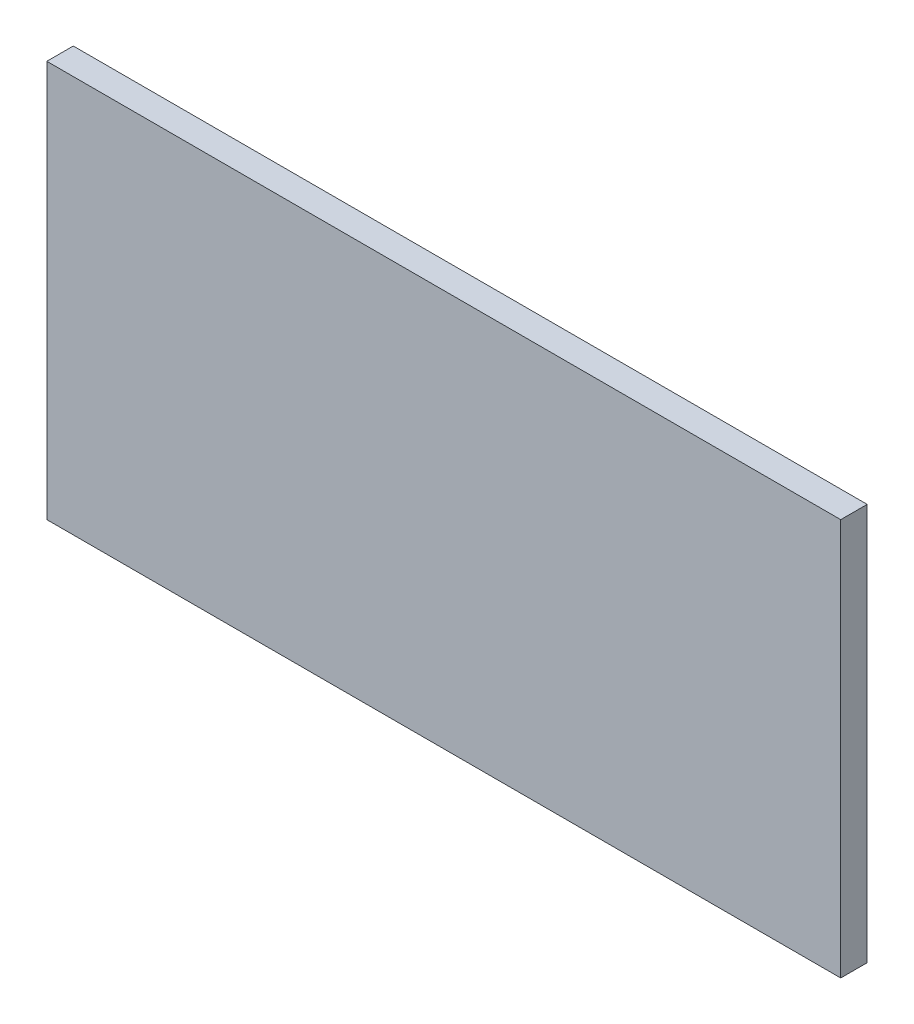
ISO-10303-21;
HEADER;
FILE_DESCRIPTION(('STEP AP214'),'2;1');
FILE_NAME('part.step','',(''),(''),'','','');
FILE_SCHEMA(('AUTOMOTIVE_DESIGN { 1 0 10303 214 1 1 1 1 }'));
ENDSEC;
DATA;
#1=APPLICATION_CONTEXT('core data for automotive mechanical design processes');
#2=APPLICATION_PROTOCOL_DEFINITION('international standard','automotive_design',2000,#1);
#3=PRODUCT_CONTEXT('',#1,'mechanical');
#4=PRODUCT('Part','Part','',(#3));
#5=PRODUCT_RELATED_PRODUCT_CATEGORY('part','',(#4));
#6=PRODUCT_DEFINITION_FORMATION('','',#4);
#7=PRODUCT_DEFINITION_CONTEXT('part definition',#1,'design');
#8=PRODUCT_DEFINITION('design','',#6,#7);
#9=PRODUCT_DEFINITION_SHAPE('','',#8);
#10=(LENGTH_UNIT() NAMED_UNIT(*) SI_UNIT(.MILLI.,.METRE.));
#11=(NAMED_UNIT(*) PLANE_ANGLE_UNIT() SI_UNIT($,.RADIAN.));
#12=(NAMED_UNIT(*) SI_UNIT($,.STERADIAN.) SOLID_ANGLE_UNIT());
#13=UNCERTAINTY_MEASURE_WITH_UNIT(LENGTH_MEASURE(1.E-05),#10,'distance_accuracy_value','');
#14=(GEOMETRIC_REPRESENTATION_CONTEXT(3) GLOBAL_UNCERTAINTY_ASSIGNED_CONTEXT((#13)) GLOBAL_UNIT_ASSIGNED_CONTEXT((#10,
#11,#12)) REPRESENTATION_CONTEXT('',''));
#15=CARTESIAN_POINT('',(0.,0.,0.));
#16=DIRECTION('',(0.,0.,1.));
#17=DIRECTION('',(1.,0.,0.));
#18=AXIS2_PLACEMENT_3D('',#15,#16,#17);
#19=CARTESIAN_POINT('',(0.,0.,-2.));
#20=DIRECTION('',(0.,0.,-1.));
#21=DIRECTION('',(-1.,0.,0.));
#22=AXIS2_PLACEMENT_3D('',#19,#20,#21);
#23=PLANE('',#22);
#24=DIRECTION('',(0.,1.,0.));
#25=VECTOR('',#24,1.);
#26=CARTESIAN_POINT('',(-2.,3.75,-2.));
#27=LINE('',#26,#25);
#28=CARTESIAN_POINT('',(-2.,-3.75,-2.));
#29=VERTEX_POINT('',#28);
#30=CARTESIAN_POINT('',(-2.,3.75,-2.));
#31=VERTEX_POINT('',#30);
#32=EDGE_CURVE('E167',#29,#31,#27,.T.);
#33=ORIENTED_EDGE('',*,*,#32,.F.);
#34=DIRECTION('',(-1.,0.,0.));
#35=VECTOR('',#34,1.);
#36=CARTESIAN_POINT('',(3.75,-3.75,-2.));
#37=LINE('',#36,#35);
#38=CARTESIAN_POINT('',(-3.75,-3.75,-2.));
#39=VERTEX_POINT('',#38);
#40=EDGE_CURVE('E162',#29,#39,#37,.T.);
#41=ORIENTED_EDGE('',*,*,#40,.T.);
#42=DIRECTION('',(0.,1.,0.));
#43=VECTOR('',#42,1.);
#44=CARTESIAN_POINT('',(-3.75,3.75,-2.));
#45=LINE('',#44,#43);
#46=CARTESIAN_POINT('',(-3.75,3.75,-2.));
#47=VERTEX_POINT('',#46);
#48=EDGE_CURVE('E187',#39,#47,#45,.T.);
#49=ORIENTED_EDGE('',*,*,#48,.T.);
#50=DIRECTION('',(1.,0.,0.));
#51=VECTOR('',#50,1.);
#52=CARTESIAN_POINT('',(3.75,3.75,-2.));
#53=LINE('',#52,#51);
#54=EDGE_CURVE('E193',#47,#31,#53,.T.);
#55=ORIENTED_EDGE('',*,*,#54,.T.);
#56=EDGE_LOOP('',(#33,#41,#49,#55));
#57=FACE_BOUND('',#56,.T.);
#58=ADVANCED_FACE('F41',(#57),#23,.T.);
#59=CARTESIAN_POINT('',(0.,0.,0.));
#60=DIRECTION('',(0.,0.,1.));
#61=DIRECTION('',(1.,0.,0.));
#62=AXIS2_PLACEMENT_3D('',#59,#60,#61);
#63=PLANE('',#62);
#64=DIRECTION('',(0.,1.,0.));
#65=VECTOR('',#64,1.);
#66=CARTESIAN_POINT('',(75.,37.5,0.));
#67=LINE('',#66,#65);
#68=CARTESIAN_POINT('',(75.,-37.5,0.));
#69=VERTEX_POINT('',#68);
#70=CARTESIAN_POINT('',(75.,37.5,0.));
#71=VERTEX_POINT('',#70);
#72=EDGE_CURVE('E227',#69,#71,#67,.T.);
#73=ORIENTED_EDGE('',*,*,#72,.F.);
#74=DIRECTION('',(1.,0.,0.));
#75=VECTOR('',#74,1.);
#76=CARTESIAN_POINT('',(-75.,-37.5,0.));
#77=LINE('',#76,#75);
#78=CARTESIAN_POINT('',(-75.,-37.5,0.));
#79=VERTEX_POINT('',#78);
#80=EDGE_CURVE('E233',#79,#69,#77,.T.);
#81=ORIENTED_EDGE('',*,*,#80,.F.);
#82=DIRECTION('',(0.,-1.,0.));
#83=VECTOR('',#82,1.);
#84=CARTESIAN_POINT('',(-75.,37.5,0.));
#85=LINE('',#84,#83);
#86=CARTESIAN_POINT('',(-75.,37.5,0.));
#87=VERTEX_POINT('',#86);
#88=EDGE_CURVE('E249',#87,#79,#85,.T.);
#89=ORIENTED_EDGE('',*,*,#88,.F.);
#90=DIRECTION('',(-1.,0.,0.));
#91=VECTOR('',#90,1.);
#92=CARTESIAN_POINT('',(-75.,37.5,0.));
#93=LINE('',#92,#91);
#94=EDGE_CURVE('E246',#71,#87,#93,.T.);
#95=ORIENTED_EDGE('',*,*,#94,.F.);
#96=EDGE_LOOP('',(#73,#81,#89,#95));
#97=FACE_BOUND('',#96,.T.);
#98=DIRECTION('',(0.,1.,0.));
#99=VECTOR('',#98,1.);
#100=CARTESIAN_POINT('',(-3.75,3.75,0.));
#101=LINE('',#100,#99);
#102=CARTESIAN_POINT('',(-3.75,-3.75,0.));
#103=VERTEX_POINT('',#102);
#104=CARTESIAN_POINT('',(-3.75,3.75,0.));
#105=VERTEX_POINT('',#104);
#106=EDGE_CURVE('E186',#103,#105,#101,.T.);
#107=ORIENTED_EDGE('',*,*,#106,.F.);
#108=DIRECTION('',(-1.,0.,0.));
#109=VECTOR('',#108,1.);
#110=CARTESIAN_POINT('',(3.75,-3.75,0.));
#111=LINE('',#110,#109);
#112=CARTESIAN_POINT('',(3.75,-3.75,0.));
#113=VERTEX_POINT('',#112);
#114=EDGE_CURVE('E192',#113,#103,#111,.T.);
#115=ORIENTED_EDGE('',*,*,#114,.F.);
#116=DIRECTION('',(0.,-1.,0.));
#117=VECTOR('',#116,1.);
#118=CARTESIAN_POINT('',(3.75,3.75,0.));
#119=LINE('',#118,#117);
#120=CARTESIAN_POINT('',(3.75,3.75,0.));
#121=VERTEX_POINT('',#120);
#122=EDGE_CURVE('E206',#121,#113,#119,.T.);
#123=ORIENTED_EDGE('',*,*,#122,.F.);
#124=DIRECTION('',(1.,0.,0.));
#125=VECTOR('',#124,1.);
#126=CARTESIAN_POINT('',(3.75,3.75,0.));
#127=LINE('',#126,#125);
#128=EDGE_CURVE('E202',#105,#121,#127,.T.);
#129=ORIENTED_EDGE('',*,*,#128,.F.);
#130=EDGE_LOOP('',(#107,#115,#123,#129));
#131=FACE_BOUND('',#130,.T.);
#132=ADVANCED_FACE('F327',(#97,#131),#63,.F.);
#133=CARTESIAN_POINT('',(75.,37.5,5.));
#134=DIRECTION('',(-1.,0.,0.));
#135=DIRECTION('',(0.,0.,1.));
#136=AXIS2_PLACEMENT_3D('',#133,#134,#135);
#137=PLANE('',#136);
#138=ORIENTED_EDGE('',*,*,#72,.T.);
#139=DIRECTION('',(0.,0.,-1.));
#140=VECTOR('',#139,1.);
#141=CARTESIAN_POINT('',(75.,37.5,5.));
#142=LINE('',#141,#140);
#143=CARTESIAN_POINT('',(75.,37.5,5.));
#144=VERTEX_POINT('',#143);
#145=EDGE_CURVE('E265',#144,#71,#142,.T.);
#146=ORIENTED_EDGE('',*,*,#145,.F.);
#147=DIRECTION('',(0.,1.,0.));
#148=VECTOR('',#147,1.);
#149=CARTESIAN_POINT('',(75.,37.5,5.));
#150=LINE('',#149,#148);
#151=CARTESIAN_POINT('',(75.,-37.5,5.));
#152=VERTEX_POINT('',#151);
#153=EDGE_CURVE('E228',#152,#144,#150,.T.);
#154=ORIENTED_EDGE('',*,*,#153,.F.);
#155=DIRECTION('',(0.,0.,-1.));
#156=VECTOR('',#155,1.);
#157=CARTESIAN_POINT('',(75.,-37.5,5.));
#158=LINE('',#157,#156);
#159=EDGE_CURVE('E242',#152,#69,#158,.T.);
#160=ORIENTED_EDGE('',*,*,#159,.T.);
#161=EDGE_LOOP('',(#138,#146,#154,#160));
#162=FACE_BOUND('',#161,.T.);
#163=ADVANCED_FACE('F334',(#162),#137,.F.);
#164=CARTESIAN_POINT('',(-75.,37.5,5.));
#165=DIRECTION('',(0.,-1.,0.));
#166=DIRECTION('',(0.,0.,-1.));
#167=AXIS2_PLACEMENT_3D('',#164,#165,#166);
#168=PLANE('',#167);
#169=ORIENTED_EDGE('',*,*,#94,.T.);
#170=DIRECTION('',(0.,0.,-1.));
#171=VECTOR('',#170,1.);
#172=CARTESIAN_POINT('',(-75.,37.5,5.));
#173=LINE('',#172,#171);
#174=CARTESIAN_POINT('',(-75.,37.5,5.));
#175=VERTEX_POINT('',#174);
#176=EDGE_CURVE('E261',#175,#87,#173,.T.);
#177=ORIENTED_EDGE('',*,*,#176,.F.);
#178=DIRECTION('',(-1.,0.,0.));
#179=VECTOR('',#178,1.);
#180=CARTESIAN_POINT('',(-75.,37.5,5.));
#181=LINE('',#180,#179);
#182=EDGE_CURVE('E232',#144,#175,#181,.T.);
#183=ORIENTED_EDGE('',*,*,#182,.F.);
#184=ORIENTED_EDGE('',*,*,#145,.T.);
#185=EDGE_LOOP('',(#169,#177,#183,#184));
#186=FACE_BOUND('',#185,.T.);
#187=ADVANCED_FACE('F364',(#186),#168,.F.);
#188=CARTESIAN_POINT('',(-75.,37.5,5.));
#189=DIRECTION('',(1.,0.,0.));
#190=DIRECTION('',(0.,1.,0.));
#191=AXIS2_PLACEMENT_3D('',#188,#189,#190);
#192=PLANE('',#191);
#193=ORIENTED_EDGE('',*,*,#88,.T.);
#194=DIRECTION('',(0.,0.,-1.));
#195=VECTOR('',#194,1.);
#196=CARTESIAN_POINT('',(-75.,-37.5,5.));
#197=LINE('',#196,#195);
#198=CARTESIAN_POINT('',(-75.,-37.5,5.));
#199=VERTEX_POINT('',#198);
#200=EDGE_CURVE('E257',#199,#79,#197,.T.);
#201=ORIENTED_EDGE('',*,*,#200,.F.);
#202=DIRECTION('',(0.,-1.,0.));
#203=VECTOR('',#202,1.);
#204=CARTESIAN_POINT('',(-75.,37.5,5.));
#205=LINE('',#204,#203);
#206=EDGE_CURVE('E236',#175,#199,#205,.T.);
#207=ORIENTED_EDGE('',*,*,#206,.F.);
#208=ORIENTED_EDGE('',*,*,#176,.T.);
#209=EDGE_LOOP('',(#193,#201,#207,#208));
#210=FACE_BOUND('',#209,.T.);
#211=ADVANCED_FACE('F360',(#210),#192,.F.);
#212=CARTESIAN_POINT('',(-75.,-37.5,5.));
#213=DIRECTION('',(0.,1.,0.));
#214=DIRECTION('',(0.,0.,1.));
#215=AXIS2_PLACEMENT_3D('',#212,#213,#214);
#216=PLANE('',#215);
#217=ORIENTED_EDGE('',*,*,#80,.T.);
#218=ORIENTED_EDGE('',*,*,#159,.F.);
#219=DIRECTION('',(1.,0.,0.));
#220=VECTOR('',#219,1.);
#221=CARTESIAN_POINT('',(-75.,-37.5,5.));
#222=LINE('',#221,#220);
#223=EDGE_CURVE('E239',#199,#152,#222,.T.);
#224=ORIENTED_EDGE('',*,*,#223,.F.);
#225=ORIENTED_EDGE('',*,*,#200,.T.);
#226=EDGE_LOOP('',(#217,#218,#224,#225));
#227=FACE_BOUND('',#226,.T.);
#228=ADVANCED_FACE('F355',(#227),#216,.F.);
#229=CARTESIAN_POINT('',(0.,0.,5.));
#230=DIRECTION('',(0.,0.,1.));
#231=DIRECTION('',(1.,0.,0.));
#232=AXIS2_PLACEMENT_3D('',#229,#230,#231);
#233=PLANE('',#232);
#234=ORIENTED_EDGE('',*,*,#153,.T.);
#235=ORIENTED_EDGE('',*,*,#182,.T.);
#236=ORIENTED_EDGE('',*,*,#206,.T.);
#237=ORIENTED_EDGE('',*,*,#223,.T.);
#238=EDGE_LOOP('',(#234,#235,#236,#237));
#239=FACE_BOUND('',#238,.T.);
#240=ADVANCED_FACE('F353',(#239),#233,.T.);
#241=CARTESIAN_POINT('',(-3.75,3.75,-2.));
#242=DIRECTION('',(1.,0.,0.));
#243=DIRECTION('',(0.,1.,0.));
#244=AXIS2_PLACEMENT_3D('',#241,#242,#243);
#245=PLANE('',#244);
#246=ORIENTED_EDGE('',*,*,#106,.T.);
#247=DIRECTION('',(0.,0.,1.));
#248=VECTOR('',#247,1.);
#249=CARTESIAN_POINT('',(-3.75,3.75,-2.));
#250=LINE('',#249,#248);
#251=EDGE_CURVE('E223',#47,#105,#250,.T.);
#252=ORIENTED_EDGE('',*,*,#251,.F.);
#253=ORIENTED_EDGE('',*,*,#48,.F.);
#254=DIRECTION('',(0.,0.,1.));
#255=VECTOR('',#254,1.);
#256=CARTESIAN_POINT('',(-3.75,-3.75,-2.));
#257=LINE('',#256,#255);
#258=EDGE_CURVE('E161',#39,#103,#257,.T.);
#259=ORIENTED_EDGE('',*,*,#258,.T.);
#260=EDGE_LOOP('',(#246,#252,#253,#259));
#261=FACE_BOUND('',#260,.T.);
#262=ADVANCED_FACE('F312',(#261),#245,.F.);
#263=CARTESIAN_POINT('',(3.75,3.75,-2.));
#264=DIRECTION('',(0.,-1.,0.));
#265=DIRECTION('',(1.,0.,0.));
#266=AXIS2_PLACEMENT_3D('',#263,#264,#265);
#267=PLANE('',#266);
#268=DIRECTION('',(0.,0.,1.));
#269=VECTOR('',#268,1.);
#270=CARTESIAN_POINT('',(2.,3.75,-9.));
#271=LINE('',#270,#269);
#272=CARTESIAN_POINT('',(2.,3.75,-7.));
#273=VERTEX_POINT('',#272);
#274=CARTESIAN_POINT('',(2.,3.75,-2.));
#275=VERTEX_POINT('',#274);
#276=EDGE_CURVE('E149',#273,#275,#271,.T.);
#277=ORIENTED_EDGE('',*,*,#276,.F.);
#278=DIRECTION('',(1.,0.,0.));
#279=VECTOR('',#278,1.);
#280=CARTESIAN_POINT('',(-2.,3.75,-7.));
#281=LINE('',#280,#279);
#282=CARTESIAN_POINT('',(-2.,3.75,-7.));
#283=VERTEX_POINT('',#282);
#284=EDGE_CURVE('E11',#273,#283,#281,.F.);
#285=ORIENTED_EDGE('',*,*,#284,.T.);
#286=DIRECTION('',(0.,0.,1.));
#287=VECTOR('',#286,1.);
#288=CARTESIAN_POINT('',(-2.,3.75,-9.));
#289=LINE('',#288,#287);
#290=EDGE_CURVE('E183',#283,#31,#289,.T.);
#291=ORIENTED_EDGE('',*,*,#290,.T.);
#292=ORIENTED_EDGE('',*,*,#54,.F.);
#293=ORIENTED_EDGE('',*,*,#251,.T.);
#294=ORIENTED_EDGE('',*,*,#128,.T.);
#295=DIRECTION('',(0.,0.,1.));
#296=VECTOR('',#295,1.);
#297=CARTESIAN_POINT('',(3.75,3.75,-2.));
#298=LINE('',#297,#296);
#299=CARTESIAN_POINT('',(3.75,3.75,-2.));
#300=VERTEX_POINT('',#299);
#301=EDGE_CURVE('E219',#300,#121,#298,.T.);
#302=ORIENTED_EDGE('',*,*,#301,.F.);
#303=EDGE_CURVE('E191',#275,#300,#53,.T.);
#304=ORIENTED_EDGE('',*,*,#303,.F.);
#305=EDGE_LOOP('',(#277,#285,#291,#292,#293,#294,#302,#304));
#306=FACE_BOUND('',#305,.T.);
#307=ADVANCED_FACE('F307',(#306),#267,.F.);
#308=CARTESIAN_POINT('',(3.75,3.75,-2.));
#309=DIRECTION('',(-1.,0.,0.));
#310=DIRECTION('',(0.,-1.,0.));
#311=AXIS2_PLACEMENT_3D('',#308,#309,#310);
#312=PLANE('',#311);
#313=ORIENTED_EDGE('',*,*,#122,.T.);
#314=DIRECTION('',(0.,0.,1.));
#315=VECTOR('',#314,1.);
#316=CARTESIAN_POINT('',(3.75,-3.75,-2.));
#317=LINE('',#316,#315);
#318=CARTESIAN_POINT('',(3.75,-3.75,-2.));
#319=VERTEX_POINT('',#318);
#320=EDGE_CURVE('E216',#319,#113,#317,.T.);
#321=ORIENTED_EDGE('',*,*,#320,.F.);
#322=DIRECTION('',(0.,-1.,0.));
#323=VECTOR('',#322,1.);
#324=CARTESIAN_POINT('',(3.75,3.75,-2.));
#325=LINE('',#324,#323);
#326=EDGE_CURVE('E158',#300,#319,#325,.T.);
#327=ORIENTED_EDGE('',*,*,#326,.F.);
#328=ORIENTED_EDGE('',*,*,#301,.T.);
#329=EDGE_LOOP('',(#313,#321,#327,#328));
#330=FACE_BOUND('',#329,.T.);
#331=ADVANCED_FACE('F309',(#330),#312,.F.);
#332=CARTESIAN_POINT('',(3.75,-3.75,-2.));
#333=DIRECTION('',(0.,1.,0.));
#334=DIRECTION('',(0.,0.,1.));
#335=AXIS2_PLACEMENT_3D('',#332,#333,#334);
#336=PLANE('',#335);
#337=DIRECTION('',(0.,0.,1.));
#338=VECTOR('',#337,1.);
#339=CARTESIAN_POINT('',(-2.,-3.75,-9.));
#340=LINE('',#339,#338);
#341=CARTESIAN_POINT('',(-2.,-3.75,-7.));
#342=VERTEX_POINT('',#341);
#343=EDGE_CURVE('E150',#342,#29,#340,.T.);
#344=ORIENTED_EDGE('',*,*,#343,.F.);
#345=DIRECTION('',(-1.,0.,0.));
#346=VECTOR('',#345,1.);
#347=CARTESIAN_POINT('',(2.,-3.75,-7.));
#348=LINE('',#347,#346);
#349=CARTESIAN_POINT('',(2.,-3.75,-7.));
#350=VERTEX_POINT('',#349);
#351=EDGE_CURVE('E65',#342,#350,#348,.F.);
#352=ORIENTED_EDGE('',*,*,#351,.T.);
#353=DIRECTION('',(0.,0.,1.));
#354=VECTOR('',#353,1.);
#355=CARTESIAN_POINT('',(2.,-3.75,-9.));
#356=LINE('',#355,#354);
#357=CARTESIAN_POINT('',(2.,-3.75,-2.));
#358=VERTEX_POINT('',#357);
#359=EDGE_CURVE('E141',#350,#358,#356,.T.);
#360=ORIENTED_EDGE('',*,*,#359,.T.);
#361=EDGE_CURVE('E145',#319,#358,#37,.T.);
#362=ORIENTED_EDGE('',*,*,#361,.F.);
#363=ORIENTED_EDGE('',*,*,#320,.T.);
#364=ORIENTED_EDGE('',*,*,#114,.T.);
#365=ORIENTED_EDGE('',*,*,#258,.F.);
#366=ORIENTED_EDGE('',*,*,#40,.F.);
#367=EDGE_LOOP('',(#344,#352,#360,#362,#363,#364,#365,#366));
#368=FACE_BOUND('',#367,.T.);
#369=ADVANCED_FACE('F143',(#368),#336,.F.);
#370=DIRECTION('',(0.,-1.,0.));
#371=VECTOR('',#370,1.);
#372=CARTESIAN_POINT('',(2.,3.75,-2.));
#373=LINE('',#372,#371);
#374=EDGE_CURVE('E155',#275,#358,#373,.T.);
#375=ORIENTED_EDGE('',*,*,#374,.F.);
#376=ORIENTED_EDGE('',*,*,#303,.T.);
#377=ORIENTED_EDGE('',*,*,#326,.T.);
#378=ORIENTED_EDGE('',*,*,#361,.T.);
#379=EDGE_LOOP('',(#375,#376,#377,#378));
#380=FACE_BOUND('',#379,.T.);
#381=ADVANCED_FACE('F154',(#380),#23,.T.);
#382=CARTESIAN_POINT('',(-2.,3.75,-9.));
#383=DIRECTION('',(1.,0.,0.));
#384=DIRECTION('',(0.,0.,-1.));
#385=AXIS2_PLACEMENT_3D('',#382,#383,#384);
#386=PLANE('',#385);
#387=CARTESIAN_POINT('',(-2.,0.,-6.));
#388=DIRECTION('',(1.,0.,0.));
#389=DIRECTION('',(0.,0.,-1.));
#390=AXIS2_PLACEMENT_3D('',#387,#388,#389);
#391=CIRCLE('',#390,2.);
#392=CARTESIAN_POINT('',(-2.,0.,-8.));
#393=VERTEX_POINT('',#392);
#394=EDGE_CURVE('E175',#393,#393,#391,.T.);
#395=ORIENTED_EDGE('',*,*,#394,.T.);
#396=EDGE_LOOP('',(#395));
#397=FACE_BOUND('',#396,.T.);
#398=DIRECTION('',(0.,1.,0.));
#399=VECTOR('',#398,1.);
#400=CARTESIAN_POINT('',(-2.,3.75,-9.));
#401=LINE('',#400,#399);
#402=CARTESIAN_POINT('',(-2.,-1.75,-9.));
#403=VERTEX_POINT('',#402);
#404=CARTESIAN_POINT('',(-2.,1.75,-9.));
#405=VERTEX_POINT('',#404);
#406=EDGE_CURVE('E166',#403,#405,#401,.T.);
#407=ORIENTED_EDGE('',*,*,#406,.F.);
#408=CARTESIAN_POINT('',(-2.,-1.75,-7.));
#409=DIRECTION('',(1.,0.,0.));
#410=DIRECTION('',(0.,0.,-1.));
#411=AXIS2_PLACEMENT_3D('',#408,#409,#410);
#412=CIRCLE('',#411,2.);
#413=EDGE_CURVE('E280',#403,#342,#412,.F.);
#414=ORIENTED_EDGE('',*,*,#413,.T.);
#415=ORIENTED_EDGE('',*,*,#343,.T.);
#416=ORIENTED_EDGE('',*,*,#32,.T.);
#417=ORIENTED_EDGE('',*,*,#290,.F.);
#418=CARTESIAN_POINT('',(-2.,1.75,-7.));
#419=DIRECTION('',(1.,0.,0.));
#420=DIRECTION('',(0.,0.,-1.));
#421=AXIS2_PLACEMENT_3D('',#418,#419,#420);
#422=CIRCLE('',#421,2.);
#423=EDGE_CURVE('E277',#283,#405,#422,.F.);
#424=ORIENTED_EDGE('',*,*,#423,.T.);
#425=EDGE_LOOP('',(#407,#414,#415,#416,#417,#424));
#426=FACE_BOUND('',#425,.T.);
#427=ADVANCED_FACE('F297',(#397,#426),#386,.F.);
#428=CARTESIAN_POINT('',(2.,3.75,-9.));
#429=DIRECTION('',(-1.,0.,0.));
#430=DIRECTION('',(0.,0.,1.));
#431=AXIS2_PLACEMENT_3D('',#428,#429,#430);
#432=PLANE('',#431);
#433=CARTESIAN_POINT('',(2.,0.,-6.));
#434=DIRECTION('',(1.,0.,0.));
#435=DIRECTION('',(0.,0.,-1.));
#436=AXIS2_PLACEMENT_3D('',#433,#434,#435);
#437=CIRCLE('',#436,2.);
#438=CARTESIAN_POINT('',(2.,0.,-8.));
#439=VERTEX_POINT('',#438);
#440=EDGE_CURVE('E483',#439,#439,#437,.T.);
#441=ORIENTED_EDGE('',*,*,#440,.F.);
#442=EDGE_LOOP('',(#441));
#443=FACE_BOUND('',#442,.T.);
#444=ORIENTED_EDGE('',*,*,#359,.F.);
#445=CARTESIAN_POINT('',(2.,-1.75,-7.));
#446=DIRECTION('',(-1.,0.,0.));
#447=DIRECTION('',(0.,0.,1.));
#448=AXIS2_PLACEMENT_3D('',#445,#446,#447);
#449=CIRCLE('',#448,2.);
#450=CARTESIAN_POINT('',(2.,-1.75,-9.));
#451=VERTEX_POINT('',#450);
#452=EDGE_CURVE('E50',#350,#451,#449,.F.);
#453=ORIENTED_EDGE('',*,*,#452,.T.);
#454=DIRECTION('',(0.,-1.,0.));
#455=VECTOR('',#454,1.);
#456=CARTESIAN_POINT('',(2.,3.75,-9.));
#457=LINE('',#456,#455);
#458=CARTESIAN_POINT('',(2.,1.75,-9.));
#459=VERTEX_POINT('',#458);
#460=EDGE_CURVE('E172',#459,#451,#457,.T.);
#461=ORIENTED_EDGE('',*,*,#460,.F.);
#462=CARTESIAN_POINT('',(2.,1.75,-7.));
#463=DIRECTION('',(-1.,0.,0.));
#464=DIRECTION('',(0.,0.,1.));
#465=AXIS2_PLACEMENT_3D('',#462,#463,#464);
#466=CIRCLE('',#465,2.);
#467=EDGE_CURVE('E57',#459,#273,#466,.F.);
#468=ORIENTED_EDGE('',*,*,#467,.T.);
#469=ORIENTED_EDGE('',*,*,#276,.T.);
#470=ORIENTED_EDGE('',*,*,#374,.T.);
#471=EDGE_LOOP('',(#444,#453,#461,#468,#469,#470));
#472=FACE_BOUND('',#471,.T.);
#473=ADVANCED_FACE('F164',(#443,#472),#432,.F.);
#474=CARTESIAN_POINT('',(0.,0.,-9.));
#475=DIRECTION('',(0.,0.,-1.));
#476=DIRECTION('',(-1.,0.,0.));
#477=AXIS2_PLACEMENT_3D('',#474,#475,#476);
#478=PLANE('',#477);
#479=ORIENTED_EDGE('',*,*,#460,.T.);
#480=DIRECTION('',(-1.,0.,0.));
#481=VECTOR('',#480,1.);
#482=CARTESIAN_POINT('',(-2.,-1.75,-9.));
#483=LINE('',#482,#481);
#484=EDGE_CURVE('E273',#451,#403,#483,.T.);
#485=ORIENTED_EDGE('',*,*,#484,.T.);
#486=ORIENTED_EDGE('',*,*,#406,.T.);
#487=DIRECTION('',(1.,0.,0.));
#488=VECTOR('',#487,1.);
#489=CARTESIAN_POINT('',(2.,1.75,-9.));
#490=LINE('',#489,#488);
#491=EDGE_CURVE('E269',#405,#459,#490,.T.);
#492=ORIENTED_EDGE('',*,*,#491,.T.);
#493=EDGE_LOOP('',(#479,#485,#486,#492));
#494=FACE_BOUND('',#493,.T.);
#495=ADVANCED_FACE('F291',(#494),#478,.T.);
#496=CARTESIAN_POINT('',(0.,-1.75,-7.));
#497=DIRECTION('',(1.,0.,0.));
#498=DIRECTION('',(0.,0.,-1.));
#499=AXIS2_PLACEMENT_3D('',#496,#497,#498);
#500=CYLINDRICAL_SURFACE('',#499,2.);
#501=ORIENTED_EDGE('',*,*,#452,.F.);
#502=ORIENTED_EDGE('',*,*,#351,.F.);
#503=ORIENTED_EDGE('',*,*,#413,.F.);
#504=ORIENTED_EDGE('',*,*,#484,.F.);
#505=EDGE_LOOP('',(#501,#502,#503,#504));
#506=FACE_BOUND('',#505,.T.);
#507=ADVANCED_FACE('F295',(#506),#500,.T.);
#508=CARTESIAN_POINT('',(0.,1.75,-7.));
#509=DIRECTION('',(-1.,0.,0.));
#510=DIRECTION('',(0.,-1.,0.));
#511=AXIS2_PLACEMENT_3D('',#508,#509,#510);
#512=CYLINDRICAL_SURFACE('',#511,2.);
#513=ORIENTED_EDGE('',*,*,#423,.F.);
#514=ORIENTED_EDGE('',*,*,#284,.F.);
#515=ORIENTED_EDGE('',*,*,#467,.F.);
#516=ORIENTED_EDGE('',*,*,#491,.F.);
#517=EDGE_LOOP('',(#513,#514,#515,#516));
#518=FACE_BOUND('',#517,.T.);
#519=ADVANCED_FACE('F43',(#518),#512,.T.);
#520=CARTESIAN_POINT('',(-3.,0.,-6.));
#521=DIRECTION('',(1.,0.,0.));
#522=DIRECTION('',(0.,0.,-1.));
#523=AXIS2_PLACEMENT_3D('',#520,#521,#522);
#524=CYLINDRICAL_SURFACE('',#523,2.);
#525=ORIENTED_EDGE('',*,*,#440,.T.);
#526=EDGE_LOOP('',(#525));
#527=FACE_BOUND('',#526,.T.);
#528=ORIENTED_EDGE('',*,*,#394,.F.);
#529=EDGE_LOOP('',(#528));
#530=FACE_BOUND('',#529,.T.);
#531=ADVANCED_FACE('F319',(#527,#530),#524,.F.);
#532=CLOSED_SHELL('',(#58,#132,#163,#187,#211,#228,#240,#262,#307,#331,#369,#381,#427,#473,#495,
#507,#519,#531));
#533=MANIFOLD_SOLID_BREP('B2',#532);
#534=ADVANCED_BREP_SHAPE_REPRESENTATION('',(#18,#533),#14);
#535=SHAPE_DEFINITION_REPRESENTATION(#9,#534);
ENDSEC;
END-ISO-10303-21;
